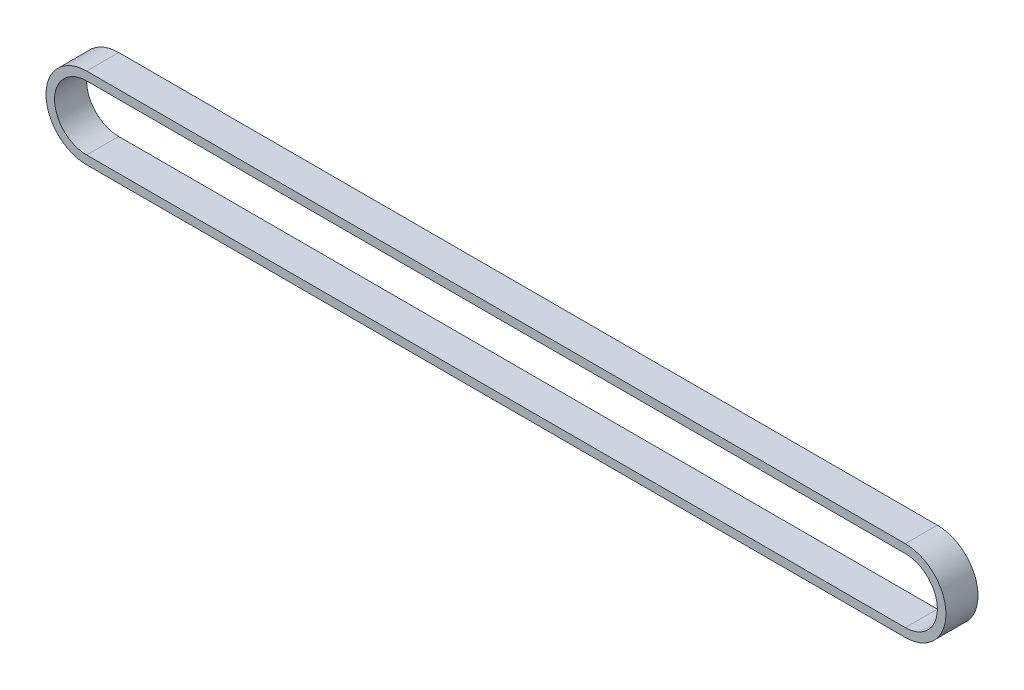
ISO-10303-21;
HEADER;
FILE_DESCRIPTION(('STEP AP214'),'2;1');
FILE_NAME('part.step','',(''),(''),'','','');
FILE_SCHEMA(('AUTOMOTIVE_DESIGN { 1 0 10303 214 1 1 1 1 }'));
ENDSEC;
DATA;
#1=APPLICATION_CONTEXT('core data for automotive mechanical design processes');
#2=APPLICATION_PROTOCOL_DEFINITION('international standard','automotive_design',2000,#1);
#3=PRODUCT_CONTEXT('',#1,'mechanical');
#4=PRODUCT('Part','Part','',(#3));
#5=PRODUCT_RELATED_PRODUCT_CATEGORY('part','',(#4));
#6=PRODUCT_DEFINITION_FORMATION('','',#4);
#7=PRODUCT_DEFINITION_CONTEXT('part definition',#1,'design');
#8=PRODUCT_DEFINITION('design','',#6,#7);
#9=PRODUCT_DEFINITION_SHAPE('','',#8);
#10=(LENGTH_UNIT() NAMED_UNIT(*) SI_UNIT(.MILLI.,.METRE.));
#11=(NAMED_UNIT(*) PLANE_ANGLE_UNIT() SI_UNIT($,.RADIAN.));
#12=(NAMED_UNIT(*) SI_UNIT($,.STERADIAN.) SOLID_ANGLE_UNIT());
#13=UNCERTAINTY_MEASURE_WITH_UNIT(LENGTH_MEASURE(1.E-05),#10,'distance_accuracy_value','');
#14=(GEOMETRIC_REPRESENTATION_CONTEXT(3) GLOBAL_UNCERTAINTY_ASSIGNED_CONTEXT((#13)) GLOBAL_UNIT_ASSIGNED_CONTEXT((#10,
#11,#12)) REPRESENTATION_CONTEXT('',''));
#15=CARTESIAN_POINT('',(0.,0.,0.));
#16=DIRECTION('',(0.,0.,1.));
#17=DIRECTION('',(1.,0.,0.));
#18=AXIS2_PLACEMENT_3D('',#15,#16,#17);
#19=CARTESIAN_POINT('',(0.,0.,15.));
#20=DIRECTION('',(0.,0.,1.));
#21=DIRECTION('',(1.,0.,0.));
#22=AXIS2_PLACEMENT_3D('',#19,#20,#21);
#23=PLANE('',#22);
#24=CARTESIAN_POINT('',(0.,0.,15.));
#25=DIRECTION('',(0.,0.,1.));
#26=DIRECTION('',(1.,0.,0.));
#27=AXIS2_PLACEMENT_3D('',#24,#25,#26);
#28=CIRCLE('',#27,19.);
#29=CARTESIAN_POINT('',(0.,19.,15.));
#30=VERTEX_POINT('',#29);
#31=CARTESIAN_POINT('',(0.,-19.,15.));
#32=VERTEX_POINT('',#31);
#33=EDGE_CURVE('E135',#30,#32,#28,.T.);
#34=ORIENTED_EDGE('',*,*,#33,.T.);
#35=DIRECTION('',(1.,0.,0.));
#36=VECTOR('',#35,1.);
#37=CARTESIAN_POINT('',(0.,-19.,15.));
#38=LINE('',#37,#36);
#39=CARTESIAN_POINT('',(383.,-19.,15.));
#40=VERTEX_POINT('',#39);
#41=EDGE_CURVE('E138',#32,#40,#38,.T.);
#42=ORIENTED_EDGE('',*,*,#41,.T.);
#43=CARTESIAN_POINT('',(383.,0.,15.));
#44=DIRECTION('',(0.,0.,1.));
#45=DIRECTION('',(1.,0.,0.));
#46=AXIS2_PLACEMENT_3D('',#43,#44,#45);
#47=CIRCLE('',#46,19.);
#48=CARTESIAN_POINT('',(383.,19.,15.));
#49=VERTEX_POINT('',#48);
#50=EDGE_CURVE('E141',#40,#49,#47,.T.);
#51=ORIENTED_EDGE('',*,*,#50,.T.);
#52=DIRECTION('',(-1.,0.,0.));
#53=VECTOR('',#52,1.);
#54=CARTESIAN_POINT('',(0.,19.,15.));
#55=LINE('',#54,#53);
#56=EDGE_CURVE('E143',#49,#30,#55,.T.);
#57=ORIENTED_EDGE('',*,*,#56,.T.);
#58=EDGE_LOOP('',(#34,#42,#51,#57));
#59=FACE_BOUND('',#58,.T.);
#60=DIRECTION('',(1.,0.,0.));
#61=VECTOR('',#60,1.);
#62=CARTESIAN_POINT('',(0.,-15.,15.));
#63=LINE('',#62,#61);
#64=CARTESIAN_POINT('',(0.,-15.,15.));
#65=VERTEX_POINT('',#64);
#66=CARTESIAN_POINT('',(383.,-15.,15.));
#67=VERTEX_POINT('',#66);
#68=EDGE_CURVE('E107',#65,#67,#63,.T.);
#69=ORIENTED_EDGE('',*,*,#68,.F.);
#70=CARTESIAN_POINT('',(0.,0.,15.));
#71=DIRECTION('',(0.,0.,1.));
#72=DIRECTION('',(1.,0.,0.));
#73=AXIS2_PLACEMENT_3D('',#70,#71,#72);
#74=CIRCLE('',#73,15.);
#75=CARTESIAN_POINT('',(0.,15.,15.));
#76=VERTEX_POINT('',#75);
#77=EDGE_CURVE('E99',#76,#65,#74,.T.);
#78=ORIENTED_EDGE('',*,*,#77,.F.);
#79=DIRECTION('',(-1.,0.,0.));
#80=VECTOR('',#79,1.);
#81=CARTESIAN_POINT('',(0.,15.,15.));
#82=LINE('',#81,#80);
#83=CARTESIAN_POINT('',(383.,15.,15.));
#84=VERTEX_POINT('',#83);
#85=EDGE_CURVE('E121',#84,#76,#82,.T.);
#86=ORIENTED_EDGE('',*,*,#85,.F.);
#87=CARTESIAN_POINT('',(383.,0.,15.));
#88=DIRECTION('',(0.,0.,1.));
#89=DIRECTION('',(1.,0.,0.));
#90=AXIS2_PLACEMENT_3D('',#87,#88,#89);
#91=CIRCLE('',#90,15.);
#92=EDGE_CURVE('E119',#67,#84,#91,.T.);
#93=ORIENTED_EDGE('',*,*,#92,.F.);
#94=EDGE_LOOP('',(#69,#78,#86,#93));
#95=FACE_BOUND('',#94,.T.);
#96=ADVANCED_FACE('F34',(#59,#95),#23,.T.);
#97=CARTESIAN_POINT('',(0.,0.,0.));
#98=DIRECTION('',(0.,0.,1.));
#99=DIRECTION('',(1.,0.,0.));
#100=AXIS2_PLACEMENT_3D('',#97,#98,#99);
#101=PLANE('',#100);
#102=CARTESIAN_POINT('',(0.,0.,0.));
#103=DIRECTION('',(0.,0.,1.));
#104=DIRECTION('',(1.,0.,0.));
#105=AXIS2_PLACEMENT_3D('',#102,#103,#104);
#106=CIRCLE('',#105,19.);
#107=CARTESIAN_POINT('',(0.,19.,0.));
#108=VERTEX_POINT('',#107);
#109=CARTESIAN_POINT('',(0.,-19.,0.));
#110=VERTEX_POINT('',#109);
#111=EDGE_CURVE('E115',#108,#110,#106,.T.);
#112=ORIENTED_EDGE('',*,*,#111,.F.);
#113=DIRECTION('',(-1.,0.,0.));
#114=VECTOR('',#113,1.);
#115=CARTESIAN_POINT('',(0.,19.,0.));
#116=LINE('',#115,#114);
#117=CARTESIAN_POINT('',(383.,19.,0.));
#118=VERTEX_POINT('',#117);
#119=EDGE_CURVE('E139',#118,#108,#116,.T.);
#120=ORIENTED_EDGE('',*,*,#119,.F.);
#121=CARTESIAN_POINT('',(383.,0.,0.));
#122=DIRECTION('',(0.,0.,1.));
#123=DIRECTION('',(1.,0.,0.));
#124=AXIS2_PLACEMENT_3D('',#121,#122,#123);
#125=CIRCLE('',#124,19.);
#126=CARTESIAN_POINT('',(383.,-19.,0.));
#127=VERTEX_POINT('',#126);
#128=EDGE_CURVE('E150',#127,#118,#125,.T.);
#129=ORIENTED_EDGE('',*,*,#128,.F.);
#130=DIRECTION('',(1.,0.,0.));
#131=VECTOR('',#130,1.);
#132=CARTESIAN_POINT('',(0.,-19.,0.));
#133=LINE('',#132,#131);
#134=EDGE_CURVE('E148',#110,#127,#133,.T.);
#135=ORIENTED_EDGE('',*,*,#134,.F.);
#136=EDGE_LOOP('',(#112,#120,#129,#135));
#137=FACE_BOUND('',#136,.T.);
#138=CARTESIAN_POINT('',(0.,0.,0.));
#139=DIRECTION('',(0.,0.,1.));
#140=DIRECTION('',(1.,0.,0.));
#141=AXIS2_PLACEMENT_3D('',#138,#139,#140);
#142=CIRCLE('',#141,15.);
#143=CARTESIAN_POINT('',(0.,15.,0.));
#144=VERTEX_POINT('',#143);
#145=CARTESIAN_POINT('',(0.,-15.,0.));
#146=VERTEX_POINT('',#145);
#147=EDGE_CURVE('E57',#144,#146,#142,.T.);
#148=ORIENTED_EDGE('',*,*,#147,.T.);
#149=DIRECTION('',(1.,0.,0.));
#150=VECTOR('',#149,1.);
#151=CARTESIAN_POINT('',(0.,-15.,0.));
#152=LINE('',#151,#150);
#153=CARTESIAN_POINT('',(383.,-15.,0.));
#154=VERTEX_POINT('',#153);
#155=EDGE_CURVE('E114',#146,#154,#152,.T.);
#156=ORIENTED_EDGE('',*,*,#155,.T.);
#157=CARTESIAN_POINT('',(383.,0.,0.));
#158=DIRECTION('',(0.,0.,1.));
#159=DIRECTION('',(1.,0.,0.));
#160=AXIS2_PLACEMENT_3D('',#157,#158,#159);
#161=CIRCLE('',#160,15.);
#162=CARTESIAN_POINT('',(383.,15.,0.));
#163=VERTEX_POINT('',#162);
#164=EDGE_CURVE('E127',#154,#163,#161,.T.);
#165=ORIENTED_EDGE('',*,*,#164,.T.);
#166=DIRECTION('',(-1.,0.,0.));
#167=VECTOR('',#166,1.);
#168=CARTESIAN_POINT('',(0.,15.,0.));
#169=LINE('',#168,#167);
#170=EDGE_CURVE('E108',#163,#144,#169,.T.);
#171=ORIENTED_EDGE('',*,*,#170,.T.);
#172=EDGE_LOOP('',(#148,#156,#165,#171));
#173=FACE_BOUND('',#172,.T.);
#174=ADVANCED_FACE('F168',(#137,#173),#101,.F.);
#175=CARTESIAN_POINT('',(0.,0.,15.));
#176=DIRECTION('',(0.,0.,-1.));
#177=DIRECTION('',(-1.,0.,0.));
#178=AXIS2_PLACEMENT_3D('',#175,#176,#177);
#179=CYLINDRICAL_SURFACE('',#178,19.);
#180=ORIENTED_EDGE('',*,*,#111,.T.);
#181=DIRECTION('',(0.,0.,-1.));
#182=VECTOR('',#181,1.);
#183=CARTESIAN_POINT('',(0.,-19.,15.));
#184=LINE('',#183,#182);
#185=EDGE_CURVE('E11',#32,#110,#184,.T.);
#186=ORIENTED_EDGE('',*,*,#185,.F.);
#187=ORIENTED_EDGE('',*,*,#33,.F.);
#188=DIRECTION('',(0.,0.,-1.));
#189=VECTOR('',#188,1.);
#190=CARTESIAN_POINT('',(0.,19.,15.));
#191=LINE('',#190,#189);
#192=EDGE_CURVE('E145',#30,#108,#191,.T.);
#193=ORIENTED_EDGE('',*,*,#192,.T.);
#194=EDGE_LOOP('',(#180,#186,#187,#193));
#195=FACE_BOUND('',#194,.T.);
#196=ADVANCED_FACE('F36',(#195),#179,.T.);
#197=CARTESIAN_POINT('',(0.,-19.,15.));
#198=DIRECTION('',(0.,1.,0.));
#199=DIRECTION('',(0.,0.,1.));
#200=AXIS2_PLACEMENT_3D('',#197,#198,#199);
#201=PLANE('',#200);
#202=ORIENTED_EDGE('',*,*,#134,.T.);
#203=DIRECTION('',(0.,0.,-1.));
#204=VECTOR('',#203,1.);
#205=CARTESIAN_POINT('',(383.,-19.,15.));
#206=LINE('',#205,#204);
#207=EDGE_CURVE('E42',#40,#127,#206,.T.);
#208=ORIENTED_EDGE('',*,*,#207,.F.);
#209=ORIENTED_EDGE('',*,*,#41,.F.);
#210=ORIENTED_EDGE('',*,*,#185,.T.);
#211=EDGE_LOOP('',(#202,#208,#209,#210));
#212=FACE_BOUND('',#211,.T.);
#213=ADVANCED_FACE('F178',(#212),#201,.F.);
#214=CARTESIAN_POINT('',(383.,0.,15.));
#215=DIRECTION('',(0.,0.,-1.));
#216=DIRECTION('',(-1.,0.,0.));
#217=AXIS2_PLACEMENT_3D('',#214,#215,#216);
#218=CYLINDRICAL_SURFACE('',#217,19.);
#219=ORIENTED_EDGE('',*,*,#128,.T.);
#220=DIRECTION('',(0.,0.,-1.));
#221=VECTOR('',#220,1.);
#222=CARTESIAN_POINT('',(383.,19.,15.));
#223=LINE('',#222,#221);
#224=EDGE_CURVE('E155',#49,#118,#223,.T.);
#225=ORIENTED_EDGE('',*,*,#224,.F.);
#226=ORIENTED_EDGE('',*,*,#50,.F.);
#227=ORIENTED_EDGE('',*,*,#207,.T.);
#228=EDGE_LOOP('',(#219,#225,#226,#227));
#229=FACE_BOUND('',#228,.T.);
#230=ADVANCED_FACE('F162',(#229),#218,.T.);
#231=CARTESIAN_POINT('',(0.,19.,15.));
#232=DIRECTION('',(0.,-1.,0.));
#233=DIRECTION('',(0.,0.,-1.));
#234=AXIS2_PLACEMENT_3D('',#231,#232,#233);
#235=PLANE('',#234);
#236=ORIENTED_EDGE('',*,*,#119,.T.);
#237=ORIENTED_EDGE('',*,*,#192,.F.);
#238=ORIENTED_EDGE('',*,*,#56,.F.);
#239=ORIENTED_EDGE('',*,*,#224,.T.);
#240=EDGE_LOOP('',(#236,#237,#238,#239));
#241=FACE_BOUND('',#240,.T.);
#242=ADVANCED_FACE('F172',(#241),#235,.F.);
#243=CARTESIAN_POINT('',(0.,0.,15.));
#244=DIRECTION('',(0.,0.,-1.));
#245=DIRECTION('',(-1.,0.,0.));
#246=AXIS2_PLACEMENT_3D('',#243,#244,#245);
#247=CYLINDRICAL_SURFACE('',#246,15.);
#248=ORIENTED_EDGE('',*,*,#147,.F.);
#249=DIRECTION('',(0.,0.,-1.));
#250=VECTOR('',#249,1.);
#251=CARTESIAN_POINT('',(0.,15.,15.));
#252=LINE('',#251,#250);
#253=EDGE_CURVE('E103',#76,#144,#252,.T.);
#254=ORIENTED_EDGE('',*,*,#253,.F.);
#255=ORIENTED_EDGE('',*,*,#77,.T.);
#256=DIRECTION('',(0.,0.,-1.));
#257=VECTOR('',#256,1.);
#258=CARTESIAN_POINT('',(0.,-15.,15.));
#259=LINE('',#258,#257);
#260=EDGE_CURVE('E102',#65,#146,#259,.T.);
#261=ORIENTED_EDGE('',*,*,#260,.T.);
#262=EDGE_LOOP('',(#248,#254,#255,#261));
#263=FACE_BOUND('',#262,.T.);
#264=ADVANCED_FACE('F101',(#263),#247,.F.);
#265=CARTESIAN_POINT('',(0.,-15.,15.));
#266=DIRECTION('',(0.,1.,0.));
#267=DIRECTION('',(0.,0.,1.));
#268=AXIS2_PLACEMENT_3D('',#265,#266,#267);
#269=PLANE('',#268);
#270=ORIENTED_EDGE('',*,*,#155,.F.);
#271=ORIENTED_EDGE('',*,*,#260,.F.);
#272=ORIENTED_EDGE('',*,*,#68,.T.);
#273=DIRECTION('',(0.,0.,-1.));
#274=VECTOR('',#273,1.);
#275=CARTESIAN_POINT('',(383.,-15.,15.));
#276=LINE('',#275,#274);
#277=EDGE_CURVE('E116',#67,#154,#276,.T.);
#278=ORIENTED_EDGE('',*,*,#277,.T.);
#279=EDGE_LOOP('',(#270,#271,#272,#278));
#280=FACE_BOUND('',#279,.T.);
#281=ADVANCED_FACE('F111',(#280),#269,.T.);
#282=CARTESIAN_POINT('',(383.,0.,15.));
#283=DIRECTION('',(0.,0.,-1.));
#284=DIRECTION('',(-1.,0.,0.));
#285=AXIS2_PLACEMENT_3D('',#282,#283,#284);
#286=CYLINDRICAL_SURFACE('',#285,15.);
#287=ORIENTED_EDGE('',*,*,#164,.F.);
#288=ORIENTED_EDGE('',*,*,#277,.F.);
#289=ORIENTED_EDGE('',*,*,#92,.T.);
#290=DIRECTION('',(0.,0.,-1.));
#291=VECTOR('',#290,1.);
#292=CARTESIAN_POINT('',(383.,15.,15.));
#293=LINE('',#292,#291);
#294=EDGE_CURVE('E49',#84,#163,#293,.T.);
#295=ORIENTED_EDGE('',*,*,#294,.T.);
#296=EDGE_LOOP('',(#287,#288,#289,#295));
#297=FACE_BOUND('',#296,.T.);
#298=ADVANCED_FACE('F201',(#297),#286,.F.);
#299=CARTESIAN_POINT('',(0.,15.,15.));
#300=DIRECTION('',(0.,-1.,0.));
#301=DIRECTION('',(0.,0.,-1.));
#302=AXIS2_PLACEMENT_3D('',#299,#300,#301);
#303=PLANE('',#302);
#304=ORIENTED_EDGE('',*,*,#170,.F.);
#305=ORIENTED_EDGE('',*,*,#294,.F.);
#306=ORIENTED_EDGE('',*,*,#85,.T.);
#307=ORIENTED_EDGE('',*,*,#253,.T.);
#308=EDGE_LOOP('',(#304,#305,#306,#307));
#309=FACE_BOUND('',#308,.T.);
#310=ADVANCED_FACE('F205',(#309),#303,.T.);
#311=CLOSED_SHELL('',(#96,#174,#196,#213,#230,#242,#264,#281,#298,#310));
#312=MANIFOLD_SOLID_BREP('B2',#311);
#313=ADVANCED_BREP_SHAPE_REPRESENTATION('',(#18,#312),#14);
#314=SHAPE_DEFINITION_REPRESENTATION(#9,#313);
ENDSEC;
END-ISO-10303-21;
